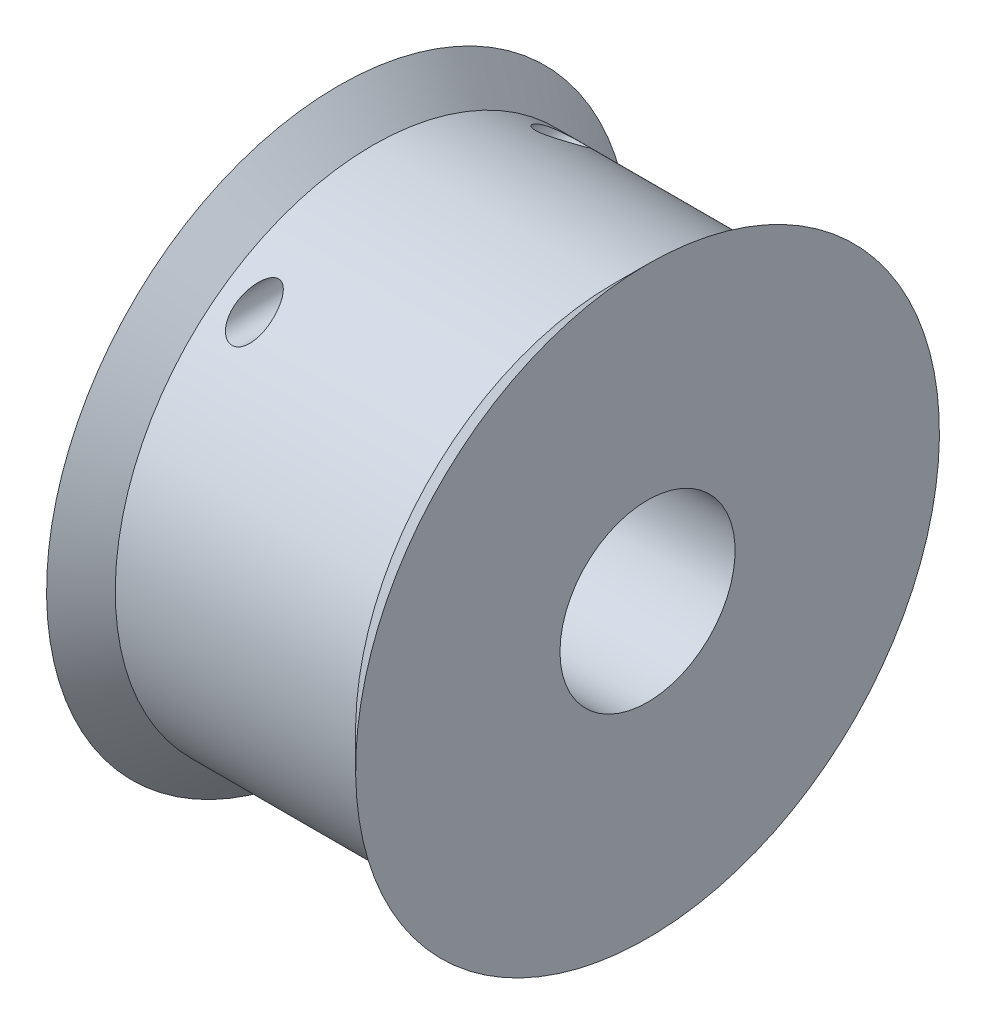
ISO-10303-21;
HEADER;
FILE_DESCRIPTION(('STEP AP214'),'2;1');
FILE_NAME('part.step','',(''),(''),'','','');
FILE_SCHEMA(('AUTOMOTIVE_DESIGN { 1 0 10303 214 1 1 1 1 }'));
ENDSEC;
DATA;
#1=APPLICATION_CONTEXT('core data for automotive mechanical design processes');
#2=APPLICATION_PROTOCOL_DEFINITION('international standard','automotive_design',2000,#1);
#3=PRODUCT_CONTEXT('',#1,'mechanical');
#4=PRODUCT('Part','Part','',(#3));
#5=PRODUCT_RELATED_PRODUCT_CATEGORY('part','',(#4));
#6=PRODUCT_DEFINITION_FORMATION('','',#4);
#7=PRODUCT_DEFINITION_CONTEXT('part definition',#1,'design');
#8=PRODUCT_DEFINITION('design','',#6,#7);
#9=PRODUCT_DEFINITION_SHAPE('','',#8);
#10=(LENGTH_UNIT() NAMED_UNIT(*) SI_UNIT(.MILLI.,.METRE.));
#11=(NAMED_UNIT(*) PLANE_ANGLE_UNIT() SI_UNIT($,.RADIAN.));
#12=(NAMED_UNIT(*) SI_UNIT($,.STERADIAN.) SOLID_ANGLE_UNIT());
#13=UNCERTAINTY_MEASURE_WITH_UNIT(LENGTH_MEASURE(1.E-05),#10,'distance_accuracy_value','');
#14=(GEOMETRIC_REPRESENTATION_CONTEXT(3) GLOBAL_UNCERTAINTY_ASSIGNED_CONTEXT((#13)) GLOBAL_UNIT_ASSIGNED_CONTEXT((#10,
#11,#12)) REPRESENTATION_CONTEXT('',''));
#15=CARTESIAN_POINT('',(0.,0.,0.));
#16=DIRECTION('',(0.,0.,1.));
#17=DIRECTION('',(1.,0.,0.));
#18=AXIS2_PLACEMENT_3D('',#15,#16,#17);
#19=CARTESIAN_POINT('',(-9.,0.,0.));
#20=DIRECTION('',(-1.,0.,0.));
#21=DIRECTION('',(0.,-1.,0.));
#22=AXIS2_PLACEMENT_3D('',#19,#20,#21);
#23=PLANE('',#22);
#24=CARTESIAN_POINT('',(-9.,0.,0.));
#25=DIRECTION('',(-1.,0.,0.));
#26=DIRECTION('',(0.,-1.,0.));
#27=AXIS2_PLACEMENT_3D('',#24,#25,#26);
#28=CIRCLE('',#27,5.1);
#29=CARTESIAN_POINT('',(-9.,-5.1,0.));
#30=VERTEX_POINT('',#29);
#31=EDGE_CURVE('E100',#30,#30,#28,.T.);
#32=ORIENTED_EDGE('',*,*,#31,.F.);
#33=EDGE_LOOP('',(#32));
#34=FACE_BOUND('',#33,.T.);
#35=CARTESIAN_POINT('',(-9.,0.,0.));
#36=DIRECTION('',(1.,0.,0.));
#37=DIRECTION('',(0.,1.,0.));
#38=AXIS2_PLACEMENT_3D('',#35,#36,#37);
#39=CIRCLE('',#38,17.);
#40=CARTESIAN_POINT('',(-9.,17.,0.));
#41=VERTEX_POINT('',#40);
#42=EDGE_CURVE('E10',#41,#41,#39,.T.);
#43=ORIENTED_EDGE('',*,*,#42,.F.);
#44=EDGE_LOOP('',(#43));
#45=FACE_BOUND('',#44,.T.);
#46=ADVANCED_FACE('F31',(#34,#45),#23,.T.);
#47=CARTESIAN_POINT('',(-7.,0.,0.));
#48=DIRECTION('',(-1.,0.,0.));
#49=DIRECTION('',(0.,-1.,0.));
#50=AXIS2_PLACEMENT_3D('',#47,#48,#49);
#51=CONICAL_SURFACE('',#50,15.,0.785398163397453);
#52=ORIENTED_EDGE('',*,*,#42,.T.);
#53=EDGE_LOOP('',(#52));
#54=FACE_BOUND('',#53,.T.);
#55=CARTESIAN_POINT('',(-7.,0.,0.));
#56=DIRECTION('',(1.,0.,0.));
#57=DIRECTION('',(0.,1.,0.));
#58=AXIS2_PLACEMENT_3D('',#55,#56,#57);
#59=CIRCLE('',#58,15.);
#60=CARTESIAN_POINT('',(-7.,15.,0.));
#61=VERTEX_POINT('',#60);
#62=EDGE_CURVE('E43',#61,#61,#59,.T.);
#63=ORIENTED_EDGE('',*,*,#62,.F.);
#64=EDGE_LOOP('',(#63));
#65=FACE_BOUND('',#64,.T.);
#66=ADVANCED_FACE('F88',(#54,#65),#51,.T.);
#67=CARTESIAN_POINT('',(9.,0.,0.));
#68=DIRECTION('',(1.,0.,0.));
#69=DIRECTION('',(0.,1.,0.));
#70=AXIS2_PLACEMENT_3D('',#67,#68,#69);
#71=CYLINDRICAL_SURFACE('',#70,15.);
#72=CARTESIAN_POINT('',(1.65,0.,-15.));
#73=CARTESIAN_POINT('',(1.64999602592176,-0.0923818218581743,-14.9999988431375));
#74=CARTESIAN_POINT('',(1.64221531734205,-0.184823472950829,-14.9991375118722));
#75=CARTESIAN_POINT('',(1.61129600565167,-0.36714038463706,-14.9957843241747));
#76=CARTESIAN_POINT('',(1.58814081236634,-0.457012763410701,-14.9932907064293));
#77=CARTESIAN_POINT('',(1.52715786204555,-0.631524868732986,-14.9869542195955));
#78=CARTESIAN_POINT('',(1.48933934752697,-0.716167852564646,-14.9831122005694));
#79=CARTESIAN_POINT('',(1.40012210952094,-0.877887506534782,-14.9745076566348));
#80=CARTESIAN_POINT('',(1.34872594722538,-0.954965599904045,-14.9697453053767));
#81=CARTESIAN_POINT('',(1.23357486983766,-1.09971749291982,-14.9598099458213));
#82=CARTESIAN_POINT('',(1.16977323615296,-1.16735402776654,-14.9546354302355));
#83=CARTESIAN_POINT('',(1.03172228204052,-1.29098229654243,-14.9444712876292));
#84=CARTESIAN_POINT('',(0.95747246093512,-1.34697347210661,-14.9394816694836));
#85=CARTESIAN_POINT('',(0.800395883029302,-1.44585644392366,-14.9302371294103));
#86=CARTESIAN_POINT('',(0.71754746772097,-1.4887140314528,-14.9259841384625));
#87=CARTESIAN_POINT('',(0.545775153249481,-1.55989482430128,-14.9187136159983));
#88=CARTESIAN_POINT('',(0.456851434026721,-1.58821845988081,-14.9156960479094));
#89=CARTESIAN_POINT('',(0.275835686758022,-1.62941572162321,-14.9112520065666));
#90=CARTESIAN_POINT('',(0.183757994705015,-1.64235163484851,-14.9098191204392));
#91=CARTESIAN_POINT('',(-0.00127181424992009,-1.65259886462405,-14.908686898868));
#92=CARTESIAN_POINT('',(-0.0942239035415667,-1.64991067288424,-14.908987508869));
#93=CARTESIAN_POINT('',(-0.277932819066921,-1.62903725829947,-14.9112824512349));
#94=CARTESIAN_POINT('',(-0.36869750429989,-1.61092026760878,-14.9132693261476));
#95=CARTESIAN_POINT('',(-0.545890269227684,-1.55980980676326,-14.9187012894236));
#96=CARTESIAN_POINT('',(-0.632318279296055,-1.5268160978437,-14.9221464011908));
#97=CARTESIAN_POINT('',(-0.798598529596559,-1.446814196343,-14.9301152023445));
#98=CARTESIAN_POINT('',(-0.878436201939901,-1.39977596429643,-14.9346411994129));
#99=CARTESIAN_POINT('',(-1.02910998413143,-1.29304180674751,-14.944259925937));
#100=CARTESIAN_POINT('',(-1.09994577484581,-1.23334543269006,-14.9493526754732));
#101=CARTESIAN_POINT('',(-1.23100135292739,-1.10260955971917,-14.9595642939927));
#102=CARTESIAN_POINT('',(-1.29116241529601,-1.03151117609732,-14.9646831571922));
#103=CARTESIAN_POINT('',(-1.39870484603087,-0.880193329427121,-14.9743446474524));
#104=CARTESIAN_POINT('',(-1.44608619509901,-0.799973852605646,-14.978887273643));
#105=CARTESIAN_POINT('',(-1.52672275506591,-0.632648549173301,-14.9868864198642));
#106=CARTESIAN_POINT('',(-1.55997472600503,-0.545541148541533,-14.9903426907391));
#107=CARTESIAN_POINT('',(-1.61136425628381,-0.366932993265998,-14.9957772807096));
#108=CARTESIAN_POINT('',(-1.62950236288869,-0.275432397824439,-14.9977556533188));
#109=CARTESIAN_POINT('',(-1.65007418859382,-0.0911434787578464,-15.0000046359516));
#110=CARTESIAN_POINT('',(-1.65258889119219,0.00163570174845487,-15.0002840523084));
#111=CARTESIAN_POINT('',(-1.64205560627016,0.186294166416551,-14.9991273146614));
#112=CARTESIAN_POINT('',(-1.62900787403707,0.278173465315143,-14.9976911887995));
#113=CARTESIAN_POINT('',(-1.58778731886137,0.45818836055987,-14.9932703044021));
#114=CARTESIAN_POINT('',(-1.55965267471051,0.546332803398984,-14.9902894555646));
#115=CARTESIAN_POINT('',(-1.48909634060412,0.716651536032795,-14.9831132635213));
#116=CARTESIAN_POINT('',(-1.44667426744437,0.798825665625389,-14.9789178877409));
#117=CARTESIAN_POINT('',(-1.3485482782607,0.955235638443859,-14.9697593637147));
#118=CARTESIAN_POINT('',(-1.29279146137031,1.02943811324488,-14.9647931858517));
#119=CARTESIAN_POINT('',(-1.16965418632295,1.1674600255377,-14.9546593253991));
#120=CARTESIAN_POINT('',(-1.10227337372175,1.23127914630015,-14.9494916366686));
#121=CARTESIAN_POINT('',(-0.957446161792615,1.34700625191035,-14.9395104302445));
#122=CARTESIAN_POINT('',(-0.879957000690629,1.39886088486303,-14.9346985615749));
#123=CARTESIAN_POINT('',(-0.717322352078209,1.48881961499014,-14.9259997112416));
#124=CARTESIAN_POINT('',(-0.632176988011976,1.52692393381705,-14.9221127146694));
#125=CARTESIAN_POINT('',(-0.456825810302722,1.5882121698463,-14.9157144017887));
#126=CARTESIAN_POINT('',(-0.366630982795063,1.61142720744416,-14.913200217783));
#127=CARTESIAN_POINT('',(-0.183594220014753,1.64237859902929,-14.9098235690547));
#128=CARTESIAN_POINT('',(-0.0907523782481195,1.65011549909774,-14.9089610460603));
#129=CARTESIAN_POINT('',(0.0944125396664033,1.64988250778876,-14.9089867901201));
#130=CARTESIAN_POINT('',(0.186735733919731,1.64199642382743,-14.9098657154103));
#131=CARTESIAN_POINT('',(0.368736786357108,1.61091769726743,-14.9132553441701));
#132=CARTESIAN_POINT('',(0.458414642460073,1.58772504262743,-14.9157660489234));
#133=CARTESIAN_POINT('',(0.632574813176139,1.52671583943657,-14.9221336424926));
#134=CARTESIAN_POINT('',(0.717058211515182,1.48890235332836,-14.9259902493827));
#135=CARTESIAN_POINT('',(0.878493138434606,1.39973329169088,-14.9346156407071));
#136=CARTESIAN_POINT('',(0.955444657686036,1.34837769938871,-14.9393844262711));
#137=CARTESIAN_POINT('',(1.1000607296797,1.23326864168925,-14.9493275259266));
#138=CARTESIAN_POINT('',(1.16767539235068,1.16945266430597,-14.9545038027611));
#139=CARTESIAN_POINT('',(1.29127092100456,1.03136150958025,-14.9646609076263));
#140=CARTESIAN_POINT('',(1.34724901402362,0.957083846303534,-14.969641688842));
#141=CARTESIAN_POINT('',(1.44611876670879,0.799929681435437,-14.9788625057048));
#142=CARTESIAN_POINT('',(1.48897084583364,0.717028162742395,-14.9831002847694));
#143=CARTESIAN_POINT('',(1.56008722850784,0.54520988552375,-14.9903338724846));
#144=CARTESIAN_POINT('',(1.58836775789974,0.45629994293742,-14.993331061833));
#145=CARTESIAN_POINT('',(1.62259125766417,0.305751892942927,-14.9970040251543));
#146=CARTESIAN_POINT('',(1.6328552237871,0.245071615108731,-14.9981221898992));
#147=CARTESIAN_POINT('',(1.6465608994454,0.122936388450105,-14.9996205603388));
#148=CARTESIAN_POINT('',(1.65000264480676,0.0614814436954419,-15.0000007699088));
#149=CARTESIAN_POINT('',(1.65,0.,-15.));
#150=B_SPLINE_CURVE_WITH_KNOTS('',3,(#72,#73,#74,#75,#76,#77,#78,#79,#80,#81,#82,#83,#84,#85,
#86,#87,#88,#89,#90,#91,#92,#93,#94,#95,#96,#97,#98,#99,#100,#101,#102,#103,#104,#105,#106,#107,
#108,#109,#110,#111,#112,#113,#114,#115,#116,#117,#118,#119,#120,#121,#122,#123,#124,#125,#126,
#127,#128,#129,#130,#131,#132,#133,#134,#135,#136,#137,#138,#139,#140,#141,#142,#143,#144,#145,
#146,#147,#148,#149),.UNSPECIFIED.,.T.,.F.,(4,2,2,2,2,2,2,2,2,2,2,2,2,2,2,2,2,2,2,2,2,2,2,2,2,2,
2,2,2,2,2,2,2,2,2,2,2,2,4),(0.,0.276920934615254,0.554141173519899,0.831186959564197,
1.10818052291128,1.38623817794144,1.66430916204827,1.94309839229293,2.22187936884106,
2.4995280019088,2.77716789707699,3.05358629881209,3.33000913709783,3.60702749676352,
3.8840556745186,4.16256356312763,4.44107187229719,4.71964401084109,4.99820606199368,
5.27532298117503,5.5524353545728,5.82884975677339,6.10527157329623,6.38280873719031,
6.66035436537183,6.93911468163531,7.21787050413386,7.49604177805969,7.77420323770548,
8.05087657749382,8.32755013493494,8.6041657723931,8.88078175246172,9.15882288790672,
9.43693020406014,9.71586805930812,9.99449463424159,10.1787905045231,10.3630854069962),.UNSPECIFIED.);
#151=CARTESIAN_POINT('',(1.65,0.,-15.));
#152=VERTEX_POINT('',#151);
#153=EDGE_CURVE('E60',#152,#152,#150,.T.);
#154=ORIENTED_EDGE('',*,*,#153,.F.);
#155=EDGE_LOOP('',(#154));
#156=FACE_BOUND('',#155,.T.);
#157=CARTESIAN_POINT('',(-4.,12.,-9.));
#158=CARTESIAN_POINT('',(-4.00000205672907,11.9578191234891,-9.0562418777175));
#159=CARTESIAN_POINT('',(-4.00266318036954,11.9152467825876,-9.11217927723115));
#160=CARTESIAN_POINT('',(-4.01368375048398,11.8295660263052,-9.22313813661234));
#161=CARTESIAN_POINT('',(-4.02204568667653,11.7864573847846,-9.27815918552185));
#162=CARTESIAN_POINT('',(-4.04495150715573,11.700219938935,-9.38667374559669));
#163=CARTESIAN_POINT('',(-4.05947976574478,11.6570914589479,-9.44017075556363));
#164=CARTESIAN_POINT('',(-4.09536366112058,11.5712886717408,-9.54514874450233));
#165=CARTESIAN_POINT('',(-4.11671204377281,11.5286139315151,-9.59663180057676));
#166=CARTESIAN_POINT('',(-4.16667069072571,11.4451182212847,-9.69605158023589));
#167=CARTESIAN_POINT('',(-4.19516388498207,11.4042788121245,-9.74403075069102));
#168=CARTESIAN_POINT('',(-4.26046437839743,11.3249277558167,-9.83614209892611));
#169=CARTESIAN_POINT('',(-4.29726298421812,11.286413727723,-9.8802782327775));
#170=CARTESIAN_POINT('',(-4.37237738671293,11.2201849169992,-9.95537445816099));
#171=CARTESIAN_POINT('',(-4.40915366746581,11.1917902805484,-9.98726168265733));
#172=CARTESIAN_POINT('',(-4.48907928746864,11.1390454366952,-10.0460549719519));
#173=CARTESIAN_POINT('',(-4.5322189759067,11.1146892213604,-10.0729684431314));
#174=CARTESIAN_POINT('',(-4.61389571168326,11.0767149168667,-10.1146919769146));
#175=CARTESIAN_POINT('',(-4.65118405661694,11.0619163356229,-10.1308615719806));
#176=CARTESIAN_POINT('',(-4.72886544929146,11.0365944084213,-10.1584415923458));
#177=CARTESIAN_POINT('',(-4.76925632470082,11.0260681029708,-10.1698553122833));
#178=CARTESIAN_POINT('',(-4.85248325374098,11.0100278497185,-10.1872190163811));
#179=CARTESIAN_POINT('',(-4.89533403701474,11.0045483914204,-10.1931314079375));
#180=CARTESIAN_POINT('',(-4.98178740596604,10.9992299618497,-10.1988704135281));
#181=CARTESIAN_POINT('',(-5.02538966609057,10.9993886065373,-10.1986995998109));
#182=CARTESIAN_POINT('',(-5.1071226325026,11.0050010040462,-10.1926426557238));
#183=CARTESIAN_POINT('',(-5.14534120825156,11.0098886052872,-10.187367600741));
#184=CARTESIAN_POINT('',(-5.22009706051823,11.0237810887989,-10.1723327854477));
#185=CARTESIAN_POINT('',(-5.25663411481379,11.0327865135525,-10.1625724342427));
#186=CARTESIAN_POINT('',(-5.3286472899072,11.0547679852154,-10.1386574896515));
#187=CARTESIAN_POINT('',(-5.36402853063119,11.067883448775,-10.1243483008335));
#188=CARTESIAN_POINT('',(-5.43171977232638,11.0972365439773,-10.0921661294291));
#189=CARTESIAN_POINT('',(-5.46402818146634,11.1134757808169,-10.0742913144176));
#190=CARTESIAN_POINT('',(-5.54259015171867,11.1581983958879,-10.0247815733032));
#191=CARTESIAN_POINT('',(-5.58652136863719,11.188445945542,-9.99104644597259));
#192=CARTESIAN_POINT('',(-5.66663601101954,11.2528377120894,-9.918468563039));
#193=CARTESIAN_POINT('',(-5.70279917358911,11.2869917722108,-9.87961286596033));
#194=CARTESIAN_POINT('',(-5.78345052958432,11.3745060750655,-9.7789004248105));
#195=CARTESIAN_POINT('',(-5.8237123496558,11.4292723237587,-9.71489647708301));
#196=CARTESIAN_POINT('',(-5.8907911173921,11.540932607123,-9.58198631785623));
#197=CARTESIAN_POINT('',(-5.91758629856007,11.5978299278541,-9.51307237411992));
#198=CARTESIAN_POINT('',(-5.9541556597913,11.6973081710011,-9.39028913518142));
#199=CARTESIAN_POINT('',(-5.96653413718024,11.7398117969885,-9.33710315090094));
#200=CARTESIAN_POINT('',(-5.98545224987107,11.8245861548772,-9.22951068089823));
#201=CARTESIAN_POINT('',(-5.99198902165976,11.8668567624784,-9.17510360999841));
#202=CARTESIAN_POINT('',(-6.00354497814972,11.9929619716114,-9.01043344574574));
#203=CARTESIAN_POINT('',(-6.00047031509983,12.0759734793953,-8.8988649488418));
#204=CARTESIAN_POINT('',(-5.98098190749623,12.1986516415364,-8.72914974636409));
#205=CARTESIAN_POINT('',(-5.97171337546252,12.2399216706904,-8.671178615979));
#206=CARTESIAN_POINT('',(-5.94797706848341,12.3211385745576,-8.55537993894102));
#207=CARTESIAN_POINT('',(-5.93351163004166,12.3610860350904,-8.497552339503));
#208=CARTESIAN_POINT('',(-5.89934215150601,12.4393182562314,-8.38261196676175));
#209=CARTESIAN_POINT('',(-5.87965517950019,12.4776079696674,-8.32549748810446));
#210=CARTESIAN_POINT('',(-5.83472845672114,12.5523865689845,-8.21231897618639));
#211=CARTESIAN_POINT('',(-5.80949262816947,12.5888767047067,-8.1562542311439));
#212=CARTESIAN_POINT('',(-5.75546006203265,12.6564906410888,-8.05088811373455));
#213=CARTESIAN_POINT('',(-5.72719574772617,12.6878006966462,-8.00143529481145));
#214=CARTESIAN_POINT('',(-5.66480027347598,12.7482867267726,-7.90470995077517));
#215=CARTESIAN_POINT('',(-5.63065599716502,12.7774577177415,-7.85744260640607));
#216=CARTESIAN_POINT('',(-5.55500111378209,12.8331998810295,-7.76607229119385));
#217=CARTESIAN_POINT('',(-5.5133976257053,12.8597308188436,-7.72202041863786));
#218=CARTESIAN_POINT('',(-5.42171908769494,12.9081936531144,-7.64072896920804));
#219=CARTESIAN_POINT('',(-5.37169353684428,12.9301508346163,-7.60345209262837));
#220=CARTESIAN_POINT('',(-5.29024123569047,12.9573664226542,-7.55691615601405));
#221=CARTESIAN_POINT('',(-5.2623845865977,12.9654224140937,-7.5430772917546));
#222=CARTESIAN_POINT('',(-5.20455834829278,12.9793048928639,-7.51916440634493));
#223=CARTESIAN_POINT('',(-5.17459068063514,12.9851333775037,-7.50908701263675));
#224=CARTESIAN_POINT('',(-5.11273818972123,12.9941195528773,-7.49352666809089));
#225=CARTESIAN_POINT('',(-5.08083730702209,12.9972501962714,-7.48809025054059));
#226=CARTESIAN_POINT('',(-5.01642502376562,13.000383414456,-7.4826494319224));
#227=CARTESIAN_POINT('',(-4.98391408109909,13.000388248304,-7.48264110791069));
#228=CARTESIAN_POINT('',(-4.92311049058557,12.9974525053097,-7.48773887741397));
#229=CARTESIAN_POINT('',(-4.89475081932801,12.9948394363459,-7.49227628467716));
#230=CARTESIAN_POINT('',(-4.83922772665874,12.9873897602969,-7.50518236585666));
#231=CARTESIAN_POINT('',(-4.8120651379468,12.9825516313833,-7.51355366194256));
#232=CARTESIAN_POINT('',(-4.74867030084354,12.9686446548787,-7.53754035198631));
#233=CARTESIAN_POINT('',(-4.71323573656507,12.9586555731973,-7.55471704753808));
#234=CARTESIAN_POINT('',(-4.64594157714565,12.9359014497805,-7.59361344134095));
#235=CARTESIAN_POINT('',(-4.61409098384531,12.9231296447385,-7.61534420308502));
#236=CARTESIAN_POINT('',(-4.53433092380125,12.8866436332031,-7.67700327012239));
#237=CARTESIAN_POINT('',(-4.48932602676816,12.861187600089,-7.71962377255272));
#238=CARTESIAN_POINT('',(-4.40698223287664,12.8067046482794,-7.80968103121696));
#239=CARTESIAN_POINT('',(-4.36966592792164,12.7776675958693,-7.85713138577987));
#240=CARTESIAN_POINT('',(-4.30473697444103,12.7199346863265,-7.95021839364001));
#241=CARTESIAN_POINT('',(-4.27653819165562,12.6914706045647,-7.99559614481948));
#242=CARTESIAN_POINT('',(-4.22474023402252,12.6328532407291,-8.08789296007402));
#243=CARTESIAN_POINT('',(-4.20114471748879,12.6026986394644,-8.13481321568886));
#244=CARTESIAN_POINT('',(-4.15813236252718,12.5409920092236,-8.22962446371421));
#245=CARTESIAN_POINT('',(-4.13871539798135,12.5094400224585,-8.27751542677887));
#246=CARTESIAN_POINT('',(-4.10378246577571,12.4451207356036,-8.37390785700624));
#247=CARTESIAN_POINT('',(-4.08826774339327,12.4123530513808,-8.42240951388086));
#248=CARTESIAN_POINT('',(-4.0499787480806,12.3188946522582,-8.55898109898261));
#249=CARTESIAN_POINT('',(-4.0314331201999,12.2569863333132,-8.64743262870083));
#250=CARTESIAN_POINT('',(-4.00643661244607,12.1303698579842,-8.82416884370329));
#251=CARTESIAN_POINT('',(-3.99999679847394,12.0656591951951,-8.91245330271318));
#252=CARTESIAN_POINT('',(-4.,12.,-9.));
#253=B_SPLINE_CURVE_WITH_KNOTS('',3,(#157,#158,#159,#160,#161,#162,#163,#164,#165,#166,#167,
#168,#169,#170,#171,#172,#173,#174,#175,#176,#177,#178,#179,#180,#181,#182,#183,#184,#185,#186,
#187,#188,#189,#190,#191,#192,#193,#194,#195,#196,#197,#198,#199,#200,#201,#202,#203,#204,#205,
#206,#207,#208,#209,#210,#211,#212,#213,#214,#215,#216,#217,#218,#219,#220,#221,#222,#223,#224,
#225,#226,#227,#228,#229,#230,#231,#232,#233,#234,#235,#236,#237,#238,#239,#240,#241,#242,#243,
#244,#245,#246,#247,#248,#249,#250,#251,#252),.UNSPECIFIED.,.T.,.F.,(4,2,2,2,2,2,2,2,2,2,2,2,2,
2,2,2,2,2,2,2,2,2,2,2,2,2,2,2,2,2,2,2,2,2,2,2,2,2,2,2,2,2,2,2,2,2,2,4),(0.,0.210831452750553,
0.421755041055521,0.632147302307697,0.84231652353769,1.04924451909495,1.25595691782014,
1.42443567408891,1.59266149192584,1.7219182996114,1.85108541501605,1.98112883072061,
2.11111725896052,2.22725159702753,2.34340123906008,2.4640189562762,2.58469882106676,
2.77295784841102,2.96170213947329,3.2402553219335,3.51925730107596,3.72658195165748,
3.93400817390186,4.34942130976134,4.56456818387381,4.77961844980807,4.99397424501722,
5.20817900667624,5.4029068309631,5.59807479642044,5.7958671850519,5.9925352641233,
6.08863726749187,6.18465289703722,6.28162029535588,6.37851761417514,6.46463870115104,
6.55081877839198,6.67200517058953,6.79348945442829,6.99338882737649,7.19386745488241,
7.37521831834321,7.55671272329772,7.73820164958109,7.91974841905122,8.2476313000902,
8.57581375276724),.UNSPECIFIED.);
#254=CARTESIAN_POINT('',(-4.,12.,-9.));
#255=VERTEX_POINT('',#254);
#256=EDGE_CURVE('E59',#255,#255,#253,.T.);
#257=ORIENTED_EDGE('',*,*,#256,.F.);
#258=EDGE_LOOP('',(#257));
#259=FACE_BOUND('',#258,.T.);
#260=CARTESIAN_POINT('',(-4.,12.,9.));
#261=CARTESIAN_POINT('',(-4.00000272242889,12.0478885177682,8.93614952430837));
#262=CARTESIAN_POINT('',(-4.00343044215819,12.0952510483816,8.87193495799582));
#263=CARTESIAN_POINT('',(-4.01682280548555,12.188655271458,8.74316918151644));
#264=CARTESIAN_POINT('',(-4.02679088527749,12.2346962563247,8.67861781209429));
#265=CARTESIAN_POINT('',(-4.05314906064192,12.325097803649,8.54974588660349));
#266=CARTESIAN_POINT('',(-4.06953294147255,12.3694599468693,8.48542516777646));
#267=CARTESIAN_POINT('',(-4.10886451364343,12.4562301707687,8.35752915123905));
#268=CARTESIAN_POINT('',(-4.13180751170927,12.4986396235626,8.29395335425104));
#269=CARTESIAN_POINT('',(-4.18544936322507,12.5822754955869,8.16653572911944));
#270=CARTESIAN_POINT('',(-4.21634066378267,12.623439181879,8.10273295052081));
#271=CARTESIAN_POINT('',(-4.28655795783711,12.7027159571327,7.97787232157071));
#272=CARTESIAN_POINT('',(-4.32587740001432,12.7408313841321,7.91681238350705));
#273=CARTESIAN_POINT('',(-4.40300076049643,12.8033442161866,7.81517448057772));
#274=CARTESIAN_POINT('',(-4.43847537492339,12.8287103419398,7.77343819654603));
#275=CARTESIAN_POINT('',(-4.51600231185248,12.8762480435373,7.69443542929115));
#276=CARTESIAN_POINT('',(-4.55803936731435,12.8984268101249,7.6571589176317));
#277=CARTESIAN_POINT('',(-4.6317070068872,12.9302010716448,7.6033195309545));
#278=CARTESIAN_POINT('',(-4.66092702628625,12.9413146471031,7.58437645006255));
#279=CARTESIAN_POINT('',(-4.72228221529028,12.9612018887165,7.55033983792541));
#280=CARTESIAN_POINT('',(-4.75441307523514,12.9699789407244,7.53524073777521));
#281=CARTESIAN_POINT('',(-4.8154331270733,12.9832246005489,7.51239134838803));
#282=CARTESIAN_POINT('',(-4.84390302619975,12.9881787855687,7.50381676501484));
#283=CARTESIAN_POINT('',(-4.90210111279245,12.995627179793,7.49090989355139));
#284=CARTESIAN_POINT('',(-4.93182799174081,12.9981238845382,7.48657330186532));
#285=CARTESIAN_POINT('',(-4.99182661442261,13.0004184310242,7.48258824691264));
#286=CARTESIAN_POINT('',(-5.02210004057147,13.0002056257021,7.48295827839079));
#287=CARTESIAN_POINT('',(-5.08208191537974,12.9970790617684,7.48838731692781));
#288=CARTESIAN_POINT('',(-5.11178999971543,12.9941636178896,7.49344924968571));
#289=CARTESIAN_POINT('',(-5.17443717479936,12.9852544640107,7.50887848005059));
#290=CARTESIAN_POINT('',(-5.20713721280717,12.9788444164485,7.51996238830862));
#291=CARTESIAN_POINT('',(-5.27001406313407,12.9634034248868,7.54654938243529));
#292=CARTESIAN_POINT('',(-5.30018630258448,12.9543678577362,7.56206026268207));
#293=CARTESIAN_POINT('',(-5.37279126312156,12.9290741921255,7.60525745166495));
#294=CARTESIAN_POINT('',(-5.413472683064,12.9114999910809,7.63508739974491));
#295=CARTESIAN_POINT('',(-5.48919581181064,12.8732099624375,7.69947267419831));
#296=CARTESIAN_POINT('',(-5.52422285685871,12.8524862285922,7.734039870365));
#297=CARTESIAN_POINT('',(-5.58596536505601,12.8110942024197,7.80239017055205));
#298=CARTESIAN_POINT('',(-5.61316722707189,12.7906479243826,7.83587547063331));
#299=CARTESIAN_POINT('',(-5.66414677258941,12.7483351640527,7.90452931517318));
#300=CARTESIAN_POINT('',(-5.68792180124229,12.7264675994825,7.93969913686668));
#301=CARTESIAN_POINT('',(-5.75476099317781,12.6590600971874,8.04706854465909));
#302=CARTESIAN_POINT('',(-5.79325918833258,12.6117722362767,8.12103363661586));
#303=CARTESIAN_POINT('',(-5.85339035388992,12.5234310485965,8.25644621610385));
#304=CARTESIAN_POINT('',(-5.87684985600345,12.4829716318483,8.31750669114117));
#305=CARTESIAN_POINT('',(-5.91760590255785,12.4001639945483,8.44046339452214));
#306=CARTESIAN_POINT('',(-5.93489873711021,12.3578146541893,8.50236010278778));
#307=CARTESIAN_POINT('',(-5.96350405019239,12.2715237737055,8.62643695375009));
#308=CARTESIAN_POINT('',(-5.97481556647553,12.2275819786083,8.68861714042955));
#309=CARTESIAN_POINT('',(-5.99141994194319,12.1383660031893,8.81282791304366));
#310=CARTESIAN_POINT('',(-5.99671080402724,12.0930913858653,8.87485844253125));
#311=CARTESIAN_POINT('',(-6.00252286322429,11.9704407766424,9.04019254038401));
#312=CARTESIAN_POINT('',(-5.99740496220436,11.8920463651716,9.14306090675219));
#313=CARTESIAN_POINT('',(-5.97488229232905,11.7737127697996,9.29428930983358));
#314=CARTESIAN_POINT('',(-5.96491324807878,11.734174019013,9.3441507634097));
#315=CARTESIAN_POINT('',(-5.93957780821565,11.6551592832663,9.44252237709427));
#316=CARTESIAN_POINT('',(-5.92421431952215,11.6156832759814,9.49103324982862));
#317=CARTESIAN_POINT('',(-5.88332698949574,11.5282239157936,9.59717667620284));
#318=CARTESIAN_POINT('',(-5.85627971926415,11.4803699009161,9.6543440716952));
#319=CARTESIAN_POINT('',(-5.79194196486948,11.3867729636458,9.76455850457506));
#320=CARTESIAN_POINT('',(-5.75466273245817,11.3410277864003,9.81760998637375));
#321=CARTESIAN_POINT('',(-5.67927718821377,11.2646796196622,9.90502312710475));
#322=CARTESIAN_POINT('',(-5.64370331953059,11.2331484591824,9.94074324461695));
#323=CARTESIAN_POINT('',(-5.5655581754362,11.1738397203462,10.0073614461759));
#324=CARTESIAN_POINT('',(-5.5229982161577,11.146056201974,10.038267173371));
#325=CARTESIAN_POINT('',(-5.4418364440919,11.1020162940491,10.086924595911));
#326=CARTESIAN_POINT('',(-5.40470383138369,11.0845902666982,10.1060562816564));
#327=CARTESIAN_POINT('',(-5.32670623263798,11.0539481239735,10.1395634402591));
#328=CARTESIAN_POINT('',(-5.28584345963526,11.0407295330269,10.153941710126));
#329=CARTESIAN_POINT('',(-5.20084729371752,11.0193910368997,10.1770956599214));
#330=CARTESIAN_POINT('',(-5.15668877649423,11.0113159978679,10.1858220504403));
#331=CARTESIAN_POINT('',(-5.06689599836973,11.0012208308039,10.1967249532873));
#332=CARTESIAN_POINT('',(-5.02126298327556,10.9991957197425,10.1989068559952));
#333=CARTESIAN_POINT('',(-4.93647562249937,11.0012418634704,10.196699227713));
#334=CARTESIAN_POINT('',(-4.8972754267507,11.0045297742748,10.193154102301));
#335=CARTESIAN_POINT('',(-4.82025365378671,11.0155181607162,10.1812781339204));
#336=CARTESIAN_POINT('',(-4.78243217751626,11.0232189587616,10.1729469412785));
#337=CARTESIAN_POINT('',(-4.70894125351483,11.0425372508137,10.1519737936657));
#338=CARTESIAN_POINT('',(-4.67327919107141,11.0541673793667,10.1393179314405));
#339=CARTESIAN_POINT('',(-4.60478576391036,11.0806758462972,10.1103417046256));
#340=CARTESIAN_POINT('',(-4.57195561489712,11.0955555700993,10.0940197769698));
#341=CARTESIAN_POINT('',(-4.49337752868078,11.136190659063,10.0492074390729));
#342=CARTESIAN_POINT('',(-4.44960500742864,11.1636172781505,10.0187617558267));
#343=CARTESIAN_POINT('',(-4.36915619005314,11.2224821845164,9.95278177291434));
#344=CARTESIAN_POINT('',(-4.33249802647889,11.253930392252,9.91723486210387));
#345=CARTESIAN_POINT('',(-4.25050183741097,11.334483006569,9.82520875925113));
#346=CARTESIAN_POINT('',(-4.20895703735697,11.3850417047179,9.76663614255411));
#347=CARTESIAN_POINT('',(-4.13833447462915,11.4886569714793,9.64454385835182));
#348=CARTESIAN_POINT('',(-4.1092740086431,11.5417168933167,9.58101747049555));
#349=CARTESIAN_POINT('',(-4.05573162837648,11.6626502743823,9.43365634205668));
#350=CARTESIAN_POINT('',(-4.03445015329954,11.7307586758927,9.34886547547546));
#351=CARTESIAN_POINT('',(-4.00657123563212,11.8662490031942,9.17628577140496));
#352=CARTESIAN_POINT('',(-3.99999622689258,11.9336296632721,9.08849256083467));
#353=CARTESIAN_POINT('',(-4.,12.,9.));
#354=B_SPLINE_CURVE_WITH_KNOTS('',3,(#260,#261,#262,#263,#264,#265,#266,#267,#268,#269,#270,
#271,#272,#273,#274,#275,#276,#277,#278,#279,#280,#281,#282,#283,#284,#285,#286,#287,#288,#289,
#290,#291,#292,#293,#294,#295,#296,#297,#298,#299,#300,#301,#302,#303,#304,#305,#306,#307,#308,
#309,#310,#311,#312,#313,#314,#315,#316,#317,#318,#319,#320,#321,#322,#323,#324,#325,#326,#327,
#328,#329,#330,#331,#332,#333,#334,#335,#336,#337,#338,#339,#340,#341,#342,#343,#344,#345,#346,
#347,#348,#349,#350,#351,#352,#353),.UNSPECIFIED.,.T.,.F.,(4,2,2,2,2,2,2,2,2,2,2,2,2,2,2,2,2,2,
2,2,2,2,2,2,2,2,2,2,2,2,2,2,2,2,2,2,2,2,2,2,2,2,2,2,2,2,4),(0.,0.239331194531372,
0.478788230392377,0.718013884850283,0.957068791703804,1.20256954195681,1.44788014841193,
1.62856920409746,1.80884399780266,1.91820929628625,2.02741524017731,2.11747502818576,
2.2074432669549,2.29776514609573,2.38814338459342,2.49291692137301,2.59787607855471,
2.75723883732438,2.91700846066011,3.06002622040813,3.20315419061891,3.48981470576578,
3.72030681465729,3.95093735538974,4.18160498761242,4.412349111901,4.7990183462332,
4.99206831377057,5.18501441118589,5.42229302269296,5.6593117449769,5.83712790476182,
6.01465882824127,6.14993224502334,6.28512592182553,6.42148327460195,6.55772828550333,
6.67564791189864,6.79357615467558,6.9118872562911,7.03024889718387,7.20911492302913,
7.38843100893139,7.65044044557194,7.91281172716822,8.24400415457949,8.57570145303014),.UNSPECIFIED.);
#355=CARTESIAN_POINT('',(-4.,12.,9.));
#356=VERTEX_POINT('',#355);
#357=EDGE_CURVE('E52',#356,#356,#354,.T.);
#358=ORIENTED_EDGE('',*,*,#357,.F.);
#359=EDGE_LOOP('',(#358));
#360=FACE_BOUND('',#359,.T.);
#361=ORIENTED_EDGE('',*,*,#62,.T.);
#362=EDGE_LOOP('',(#361));
#363=FACE_BOUND('',#362,.T.);
#364=CARTESIAN_POINT('',(7.,0.,0.));
#365=DIRECTION('',(1.,0.,0.));
#366=DIRECTION('',(0.,1.,0.));
#367=AXIS2_PLACEMENT_3D('',#364,#365,#366);
#368=CIRCLE('',#367,15.);
#369=CARTESIAN_POINT('',(7.,15.,0.));
#370=VERTEX_POINT('',#369);
#371=EDGE_CURVE('E48',#370,#370,#368,.T.);
#372=ORIENTED_EDGE('',*,*,#371,.F.);
#373=EDGE_LOOP('',(#372));
#374=FACE_BOUND('',#373,.T.);
#375=ADVANCED_FACE('F64',(#156,#259,#360,#363,#374),#71,.T.);
#376=CARTESIAN_POINT('',(9.,0.,0.));
#377=DIRECTION('',(1.,0.,0.));
#378=DIRECTION('',(0.,1.,0.));
#379=AXIS2_PLACEMENT_3D('',#376,#377,#378);
#380=CONICAL_SURFACE('',#379,17.,0.785398163397453);
#381=ORIENTED_EDGE('',*,*,#371,.T.);
#382=EDGE_LOOP('',(#381));
#383=FACE_BOUND('',#382,.T.);
#384=CARTESIAN_POINT('',(9.,0.,0.));
#385=DIRECTION('',(1.,0.,0.));
#386=DIRECTION('',(0.,1.,0.));
#387=AXIS2_PLACEMENT_3D('',#384,#385,#386);
#388=CIRCLE('',#387,17.);
#389=CARTESIAN_POINT('',(9.,17.,0.));
#390=VERTEX_POINT('',#389);
#391=EDGE_CURVE('E102',#390,#390,#388,.T.);
#392=ORIENTED_EDGE('',*,*,#391,.F.);
#393=EDGE_LOOP('',(#392));
#394=FACE_BOUND('',#393,.T.);
#395=ADVANCED_FACE('F81',(#383,#394),#380,.T.);
#396=CARTESIAN_POINT('',(9.,0.,0.));
#397=DIRECTION('',(1.,0.,0.));
#398=DIRECTION('',(0.,1.,0.));
#399=AXIS2_PLACEMENT_3D('',#396,#397,#398);
#400=PLANE('',#399);
#401=CARTESIAN_POINT('',(9.,0.,0.));
#402=DIRECTION('',(-1.,0.,0.));
#403=DIRECTION('',(0.,0.,1.));
#404=AXIS2_PLACEMENT_3D('',#401,#402,#403);
#405=CIRCLE('',#404,5.1);
#406=CARTESIAN_POINT('',(9.,0.,5.1));
#407=VERTEX_POINT('',#406);
#408=EDGE_CURVE('E103',#407,#407,#405,.T.);
#409=ORIENTED_EDGE('',*,*,#408,.T.);
#410=EDGE_LOOP('',(#409));
#411=FACE_BOUND('',#410,.T.);
#412=ORIENTED_EDGE('',*,*,#391,.T.);
#413=EDGE_LOOP('',(#412));
#414=FACE_BOUND('',#413,.T.);
#415=ADVANCED_FACE('F78',(#411,#414),#400,.T.);
#416=CARTESIAN_POINT('',(9.,0.,0.));
#417=DIRECTION('',(-1.,0.,0.));
#418=DIRECTION('',(0.,0.,1.));
#419=AXIS2_PLACEMENT_3D('',#416,#417,#418);
#420=CYLINDRICAL_SURFACE('',#419,5.1);
#421=CARTESIAN_POINT('',(1.65,0.,-5.1));
#422=CARTESIAN_POINT('',(1.64999991724303,-0.0901776614808583,-5.09999989559306));
#423=CARTESIAN_POINT('',(1.64258305864693,-0.180356972847911,-5.09758592619714));
#424=CARTESIAN_POINT('',(1.61319612974968,-0.358068395597842,-5.08819328432072));
#425=CARTESIAN_POINT('',(1.59122370453862,-0.445600076230389,-5.08121387321073));
#426=CARTESIAN_POINT('',(1.53355129359994,-0.615428303951314,-5.06345067384313));
#427=CARTESIAN_POINT('',(1.49787344981802,-0.697733046833123,-5.05267302418079));
#428=CARTESIAN_POINT('',(1.41390024649627,-0.855191272956865,-5.02841947915375));
#429=CARTESIAN_POINT('',(1.36560263065681,-0.930343474108598,-5.01494310138193));
#430=CARTESIAN_POINT('',(1.25609259765029,-1.07383243135771,-4.98622102100592));
#431=CARTESIAN_POINT('',(1.19454011926924,-1.14190149341658,-4.97093474423422));
#432=CARTESIAN_POINT('',(1.06099109902543,-1.26695278284405,-4.94054451364169));
#433=CARTESIAN_POINT('',(0.988992436857797,-1.32393275390365,-4.92544059751114));
#434=CARTESIAN_POINT('',(0.834229179766326,-1.42667968412869,-4.89668410363578));
#435=CARTESIAN_POINT('',(0.751227747343887,-1.47210516214056,-4.88308127746682));
#436=CARTESIAN_POINT('',(0.578252272891915,-1.548239665767,-4.85948086641644));
#437=CARTESIAN_POINT('',(0.488280227012973,-1.57895288651625,-4.849482254011));
#438=CARTESIAN_POINT('',(0.306950751462824,-1.62379858311779,-4.8346482307889));
#439=CARTESIAN_POINT('',(0.215729839601686,-1.63843030324966,-4.82965780181445));
#440=CARTESIAN_POINT('',(0.0320018639746402,-1.65225792355693,-4.82494581465085));
#441=CARTESIAN_POINT('',(-0.0605048216266329,-1.65145827018593,-4.82522273870659));
#442=CARTESIAN_POINT('',(-0.239982620591166,-1.63483482678179,-4.83087784831818));
#443=CARTESIAN_POINT('',(-0.327021381212628,-1.61965437715618,-4.83603758564445));
#444=CARTESIAN_POINT('',(-0.497243134425126,-1.57574669451346,-4.85052073033937));
#445=CARTESIAN_POINT('',(-0.580425689125701,-1.54701792713897,-4.85984460929392));
#446=CARTESIAN_POINT('',(-0.742069205914025,-1.4763922566661,-4.88176670200889));
#447=CARTESIAN_POINT('',(-0.82043769498142,-1.43429932207923,-4.89441314277424));
#448=CARTESIAN_POINT('',(-0.969205996085412,-1.33827627860316,-4.9215343171624));
#449=CARTESIAN_POINT('',(-1.03960360723115,-1.28434291239819,-4.93600955342275));
#450=CARTESIAN_POINT('',(-1.17405756954811,-1.1630480927749,-4.96602485362883));
#451=CARTESIAN_POINT('',(-1.23763423239022,-1.09515819281223,-4.98158234064024));
#452=CARTESIAN_POINT('',(-1.35262125592973,-0.949487621327105,-5.01138636209078));
#453=CARTESIAN_POINT('',(-1.40403058119394,-0.871706108899586,-5.02563278489612));
#454=CARTESIAN_POINT('',(-1.49358024697329,-0.707487389071953,-5.05137809450472));
#455=CARTESIAN_POINT('',(-1.53159882473936,-0.620979513912726,-5.06285148511762));
#456=CARTESIAN_POINT('',(-1.59239820035616,-0.442337274129458,-5.08157345766546));
#457=CARTESIAN_POINT('',(-1.61518397185453,-0.35020475673449,-5.08882341848851));
#458=CARTESIAN_POINT('',(-1.64403676836006,-0.166994601074296,-5.09805635124521));
#459=CARTESIAN_POINT('',(-1.65075253951643,-0.0760292804358802,-5.10024357980207));
#460=CARTESIAN_POINT('',(-1.64911368997447,0.105742381291131,-5.09971314230831));
#461=CARTESIAN_POINT('',(-1.64076144777126,0.196548745206381,-5.09699625037608));
#462=CARTESIAN_POINT('',(-1.60974070083744,0.372873369424455,-5.08709741420675));
#463=CARTESIAN_POINT('',(-1.58746457297934,0.458468204122838,-5.08003792860974));
#464=CARTESIAN_POINT('',(-1.5297133185559,0.624676289140704,-5.06228912237961));
#465=CARTESIAN_POINT('',(-1.4942365307206,0.705288910971593,-5.05159934489816));
#466=CARTESIAN_POINT('',(-1.41008692106376,0.861526428689452,-5.02734374954101));
#467=CARTESIAN_POINT('',(-1.36110153036141,0.936972406761221,-5.01371171997128));
#468=CARTESIAN_POINT('',(-1.25169608651492,1.07878765233756,-4.98512378170962));
#469=CARTESIAN_POINT('',(-1.19127272444235,1.14515428365307,-4.97016749058576));
#470=CARTESIAN_POINT('',(-1.05765456233188,1.26986961530234,-4.93981067357683));
#471=CARTESIAN_POINT('',(-0.984024918395043,1.32775553235685,-4.9244184127533));
#472=CARTESIAN_POINT('',(-0.827764102689397,1.43039974664611,-4.89559072459264));
#473=CARTESIAN_POINT('',(-0.745132969049125,1.47515809948365,-4.88215528896736));
#474=CARTESIAN_POINT('',(-0.57328470911286,1.55003196517109,-4.85890343319685));
#475=CARTESIAN_POINT('',(-0.484088157806714,1.58019115253847,-4.84907624028988));
#476=CARTESIAN_POINT('',(-0.3014950182567,1.62493896651959,-4.83426723759408));
#477=CARTESIAN_POINT('',(-0.208100196053916,1.63953407759557,-4.82928340999041));
#478=CARTESIAN_POINT('',(-0.0246279558270302,1.65225238730678,-4.82494583192055));
#479=CARTESIAN_POINT('',(0.0653909650989479,1.65113936347207,-4.82533101216338));
#480=CARTESIAN_POINT('',(0.243889548226915,1.6343355739116,-4.83104793835508));
#481=CARTESIAN_POINT('',(0.33236929198005,1.61864558293727,-4.83637942141281));
#482=CARTESIAN_POINT('',(0.503804041449141,1.57366020933029,-4.85119943993052));
#483=CARTESIAN_POINT('',(0.586826988687159,1.544598371592,-4.86061646463534));
#484=CARTESIAN_POINT('',(0.746883562414201,1.47388074339257,-4.88252388305402));
#485=CARTESIAN_POINT('',(0.823915905880539,1.4322222643648,-4.89501493276699));
#486=CARTESIAN_POINT('',(0.973268488126953,1.33547377006333,-4.9223096642309));
#487=CARTESIAN_POINT('',(1.04526037590764,1.2798979758839,-4.93718782239872));
#488=CARTESIAN_POINT('',(1.17914330143395,1.15772961708554,-4.96725419696153));
#489=CARTESIAN_POINT('',(1.24103154917393,1.09113401966079,-4.98244249770062));
#490=CARTESIAN_POINT('',(1.35518270274058,0.945942793218987,-5.01207220993587));
#491=CARTESIAN_POINT('',(1.40702029895323,0.867002193347088,-5.02646723358168));
#492=CARTESIAN_POINT('',(1.49662688289285,0.701064465826985,-5.05228105004504));
#493=CARTESIAN_POINT('',(1.53440040764506,0.614069947675347,-5.06370080231823));
#494=CARTESIAN_POINT('',(1.59266177024257,0.440215809054058,-5.08166831848012));
#495=CARTESIAN_POINT('',(1.6140981371834,0.353701210773971,-5.08848028309952));
#496=CARTESIAN_POINT('',(1.64276559614861,0.17812453562102,-5.09764564285638));
#497=CARTESIAN_POINT('',(1.6500000817341,0.0890630724871646,-5.10000010311648));
#498=CARTESIAN_POINT('',(1.65,0.,-5.1));
#499=B_SPLINE_CURVE_WITH_KNOTS('',3,(#421,#422,#423,#424,#425,#426,#427,#428,#429,#430,#431,
#432,#433,#434,#435,#436,#437,#438,#439,#440,#441,#442,#443,#444,#445,#446,#447,#448,#449,#450,
#451,#452,#453,#454,#455,#456,#457,#458,#459,#460,#461,#462,#463,#464,#465,#466,#467,#468,#469,
#470,#471,#472,#473,#474,#475,#476,#477,#478,#479,#480,#481,#482,#483,#484,#485,#486,#487,#488,
#489,#490,#491,#492,#493,#494,#495,#496,#497,#498),.UNSPECIFIED.,.T.,.F.,(4,2,2,2,2,2,2,2,2,2,2,
2,2,2,2,2,2,2,2,2,2,2,2,2,2,2,2,2,2,2,2,2,2,2,2,2,2,2,4),(0.,0.270205418927548,
0.540454564416287,0.810268929623087,1.0801315682146,1.35798481223378,1.63589453237139,
1.92125315124464,2.20653035286993,2.4826765216373,2.75874312180461,3.02301524363342,
3.2873173016726,3.55569080589859,3.82413823269322,4.10573840591475,4.3873625345336,
4.67148510861697,4.9555148687681,5.22786917632359,5.50018049634676,5.76514403926363,
6.0301409384623,6.30187522096558,6.57368823484542,6.8570959838295,7.14050253240108,
7.42305592701262,7.70549155533496,7.9742436656602,8.2429814928927,8.50719414315908,
8.77146322555741,9.04670256094916,9.32201777247422,9.60721675404268,9.8923236514363,
10.1592531430424,10.4261188436736),.UNSPECIFIED.);
#500=CARTESIAN_POINT('',(1.65,0.,-5.1));
#501=VERTEX_POINT('',#500);
#502=EDGE_CURVE('E34',#501,#501,#499,.T.);
#503=ORIENTED_EDGE('',*,*,#502,.T.);
#504=EDGE_LOOP('',(#503));
#505=FACE_BOUND('',#504,.T.);
#506=ORIENTED_EDGE('',*,*,#31,.T.);
#507=EDGE_LOOP('',(#506));
#508=FACE_BOUND('',#507,.T.);
#509=ORIENTED_EDGE('',*,*,#408,.F.);
#510=EDGE_LOOP('',(#509));
#511=FACE_BOUND('',#510,.T.);
#512=ADVANCED_FACE('F71',(#505,#508,#511),#420,.F.);
#513=CARTESIAN_POINT('',(-5.,12.,-17.));
#514=DIRECTION('',(0.,0.,1.));
#515=DIRECTION('',(1.,0.,0.));
#516=AXIS2_PLACEMENT_3D('',#513,#514,#515);
#517=CYLINDRICAL_SURFACE('',#516,1.);
#518=ORIENTED_EDGE('',*,*,#256,.T.);
#519=EDGE_LOOP('',(#518));
#520=FACE_BOUND('',#519,.T.);
#521=ORIENTED_EDGE('',*,*,#357,.T.);
#522=EDGE_LOOP('',(#521));
#523=FACE_BOUND('',#522,.T.);
#524=ADVANCED_FACE('F67',(#520,#523),#517,.F.);
#525=CARTESIAN_POINT('',(0.,0.,-17.));
#526=DIRECTION('',(0.,0.,1.));
#527=DIRECTION('',(1.,0.,0.));
#528=AXIS2_PLACEMENT_3D('',#525,#526,#527);
#529=CYLINDRICAL_SURFACE('',#528,1.65);
#530=ORIENTED_EDGE('',*,*,#153,.T.);
#531=EDGE_LOOP('',(#530));
#532=FACE_BOUND('',#531,.T.);
#533=ORIENTED_EDGE('',*,*,#502,.F.);
#534=EDGE_LOOP('',(#533));
#535=FACE_BOUND('',#534,.T.);
#536=ADVANCED_FACE('F70',(#532,#535),#529,.F.);
#537=CLOSED_SHELL('',(#46,#66,#375,#395,#415,#512,#524,#536));
#538=MANIFOLD_SOLID_BREP('B2',#537);
#539=ADVANCED_BREP_SHAPE_REPRESENTATION('',(#18,#538),#14);
#540=SHAPE_DEFINITION_REPRESENTATION(#9,#539);
ENDSEC;
END-ISO-10303-21;
